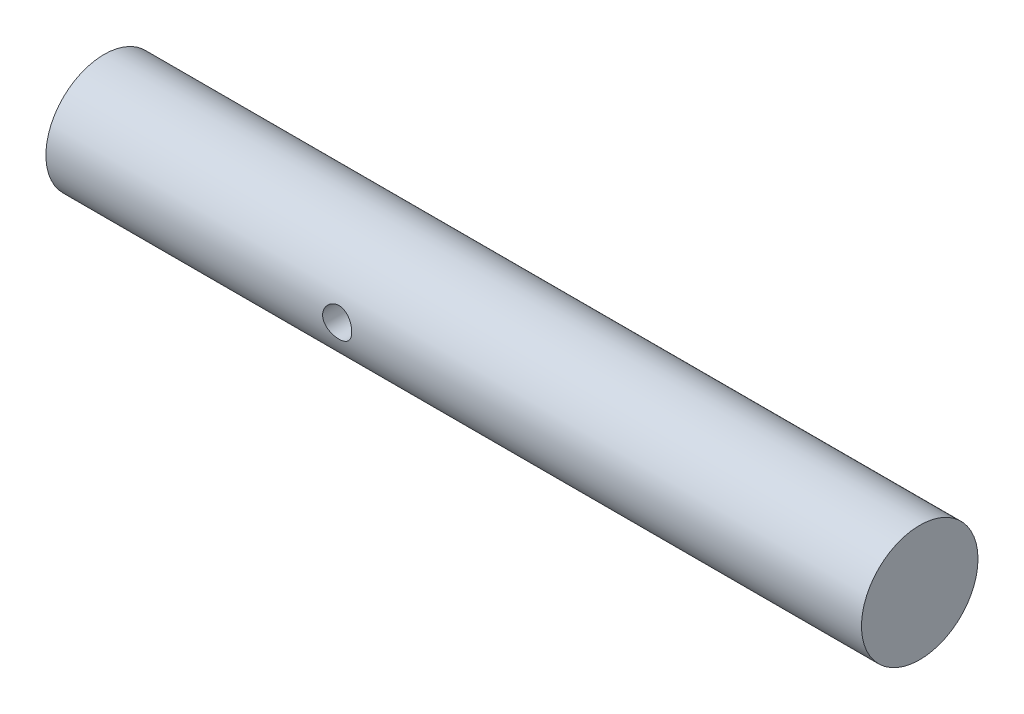
ISO-10303-21;
HEADER;
FILE_DESCRIPTION(('STEP AP214'),'2;1');
FILE_NAME('part.step','',(''),(''),'','','');
FILE_SCHEMA(('AUTOMOTIVE_DESIGN { 1 0 10303 214 1 1 1 1 }'));
ENDSEC;
DATA;
#1=APPLICATION_CONTEXT('core data for automotive mechanical design processes');
#2=APPLICATION_PROTOCOL_DEFINITION('international standard','automotive_design',2000,#1);
#3=PRODUCT_CONTEXT('',#1,'mechanical');
#4=PRODUCT('Part','Part','',(#3));
#5=PRODUCT_RELATED_PRODUCT_CATEGORY('part','',(#4));
#6=PRODUCT_DEFINITION_FORMATION('','',#4);
#7=PRODUCT_DEFINITION_CONTEXT('part definition',#1,'design');
#8=PRODUCT_DEFINITION('design','',#6,#7);
#9=PRODUCT_DEFINITION_SHAPE('','',#8);
#10=(LENGTH_UNIT() NAMED_UNIT(*) SI_UNIT(.MILLI.,.METRE.));
#11=(NAMED_UNIT(*) PLANE_ANGLE_UNIT() SI_UNIT($,.RADIAN.));
#12=(NAMED_UNIT(*) SI_UNIT($,.STERADIAN.) SOLID_ANGLE_UNIT());
#13=UNCERTAINTY_MEASURE_WITH_UNIT(LENGTH_MEASURE(1.E-05),#10,'distance_accuracy_value','');
#14=(GEOMETRIC_REPRESENTATION_CONTEXT(3) GLOBAL_UNCERTAINTY_ASSIGNED_CONTEXT((#13)) GLOBAL_UNIT_ASSIGNED_CONTEXT((#10,
#11,#12)) REPRESENTATION_CONTEXT('',''));
#15=CARTESIAN_POINT('',(0.,0.,0.));
#16=DIRECTION('',(0.,0.,1.));
#17=DIRECTION('',(1.,0.,0.));
#18=AXIS2_PLACEMENT_3D('',#15,#16,#17);
#19=CARTESIAN_POINT('',(0.,0.,0.));
#20=DIRECTION('',(1.,0.,0.));
#21=DIRECTION('',(0.,0.,-1.));
#22=AXIS2_PLACEMENT_3D('',#19,#20,#21);
#23=PLANE('',#22);
#24=CARTESIAN_POINT('',(0.,0.,0.));
#25=DIRECTION('',(1.,0.,0.));
#26=DIRECTION('',(0.,0.,-1.));
#27=AXIS2_PLACEMENT_3D('',#24,#25,#26);
#28=CIRCLE('',#27,12.7);
#29=CARTESIAN_POINT('',(0.,0.,-12.7));
#30=VERTEX_POINT('',#29);
#31=EDGE_CURVE('E56',#30,#30,#28,.T.);
#32=ORIENTED_EDGE('',*,*,#31,.F.);
#33=EDGE_LOOP('',(#32));
#34=FACE_BOUND('',#33,.T.);
#35=ADVANCED_FACE('F39',(#34),#23,.F.);
#36=CARTESIAN_POINT('',(177.8,0.,0.));
#37=DIRECTION('',(1.,0.,0.));
#38=DIRECTION('',(0.,0.,-1.));
#39=AXIS2_PLACEMENT_3D('',#36,#37,#38);
#40=PLANE('',#39);
#41=CARTESIAN_POINT('',(177.8,0.,0.));
#42=DIRECTION('',(1.,0.,0.));
#43=DIRECTION('',(0.,0.,-1.));
#44=AXIS2_PLACEMENT_3D('',#41,#42,#43);
#45=CIRCLE('',#44,12.7);
#46=CARTESIAN_POINT('',(177.8,0.,-12.7));
#47=VERTEX_POINT('',#46);
#48=EDGE_CURVE('E60',#47,#47,#45,.T.);
#49=ORIENTED_EDGE('',*,*,#48,.T.);
#50=EDGE_LOOP('',(#49));
#51=FACE_BOUND('',#50,.T.);
#52=ADVANCED_FACE('F61',(#51),#40,.T.);
#53=CARTESIAN_POINT('',(0.,0.,0.));
#54=DIRECTION('',(1.,0.,0.));
#55=DIRECTION('',(0.,0.,-1.));
#56=AXIS2_PLACEMENT_3D('',#53,#54,#55);
#57=CYLINDRICAL_SURFACE('',#56,12.7);
#58=CARTESIAN_POINT('',(60.325,0.,12.7));
#59=CARTESIAN_POINT('',(60.3250049228124,-0.175421054350931,12.6999970338729));
#60=CARTESIAN_POINT('',(60.3395871158045,-0.350897100741782,12.6963292371237));
#61=CARTESIAN_POINT('',(60.3974432369332,-0.69682005198096,12.6820530760661));
#62=CARTESIAN_POINT('',(60.4407334268551,-0.867264049209731,12.6714407780562));
#63=CARTESIAN_POINT('',(60.5545297531614,-1.19807751278645,12.6444507573613));
#64=CARTESIAN_POINT('',(60.6250032072807,-1.35845880926017,12.6280799601569));
#65=CARTESIAN_POINT('',(60.7910506089282,-1.6651226791977,12.591316443928));
#66=CARTESIAN_POINT('',(60.8866254031185,-1.81140477687155,12.5709235892463));
#67=CARTESIAN_POINT('',(61.1022416714347,-2.08873074612027,12.5278602543575));
#68=CARTESIAN_POINT('',(61.2227028336633,-2.2194428772959,12.5051546346353));
#69=CARTESIAN_POINT('',(61.4837738337241,-2.45903522924702,12.4602582924963));
#70=CARTESIAN_POINT('',(61.624385943571,-2.56791298487579,12.4380676284689));
#71=CARTESIAN_POINT('',(61.9243432299266,-2.76230618225783,12.3963594189446));
#72=CARTESIAN_POINT('',(62.0839356718785,-2.84745052370821,12.3768864828385));
#73=CARTESIAN_POINT('',(62.4157341380137,-2.9895734564324,12.343330973648));
#74=CARTESIAN_POINT('',(62.5879381405528,-3.04655655068163,12.3292475388652));
#75=CARTESIAN_POINT('',(62.9364237378602,-3.12960773790342,12.3084267567388));
#76=CARTESIAN_POINT('',(63.1125545299471,-3.15627230130284,12.3015478927701));
#77=CARTESIAN_POINT('',(63.4669134710486,-3.17978742389056,12.2954915053947));
#78=CARTESIAN_POINT('',(63.6451412741317,-3.176642833515,12.2963127290578));
#79=CARTESIAN_POINT('',(63.9940634597277,-3.14110481048737,12.3054365167726));
#80=CARTESIAN_POINT('',(64.1648357321016,-3.1094221534035,12.3135572669877));
#81=CARTESIAN_POINT('',(64.4985608910951,-3.01884119561133,12.3360753547043));
#82=CARTESIAN_POINT('',(64.6615132197445,-2.95994095604688,12.3504731393489));
#83=CARTESIAN_POINT('',(64.976878801067,-2.8159910616337,12.3840899110031));
#84=CARTESIAN_POINT('',(65.1291690636213,-2.73068344564301,12.4033560981111));
#85=CARTESIAN_POINT('',(65.4175279356519,-2.53652078423164,12.4445122129068));
#86=CARTESIAN_POINT('',(65.5535937000757,-2.42766161831204,12.4664025994163));
#87=CARTESIAN_POINT('',(65.8097143198865,-2.18580424890858,12.5111061380944));
#88=CARTESIAN_POINT('',(65.9292020039632,-2.05220624645107,12.533927803951));
#89=CARTESIAN_POINT('',(66.1441849632153,-1.76659522538282,12.5773596047503));
#90=CARTESIAN_POINT('',(66.2396795055245,-1.61458164448181,12.5979696721291));
#91=CARTESIAN_POINT('',(66.4041737408416,-1.29564529770894,12.6347586626604));
#92=CARTESIAN_POINT('',(66.4730813035385,-1.12867311562491,12.6509221227036));
#93=CARTESIAN_POINT('',(66.5816916304186,-0.785020883902428,12.676884242985));
#94=CARTESIAN_POINT('',(66.6213999810851,-0.608342698201855,12.6866841206814));
#95=CARTESIAN_POINT('',(66.6696185137662,-0.255142937325556,12.6986347345774));
#96=CARTESIAN_POINT('',(66.6789010718594,-0.0787330573083768,12.7009747992585));
#97=CARTESIAN_POINT('',(66.6681229456492,0.273119584996527,12.6982813685726));
#98=CARTESIAN_POINT('',(66.6480649027418,0.448562432914395,12.6932485369526));
#99=CARTESIAN_POINT('',(66.5798115772382,0.790816868910238,12.6764961338622));
#100=CARTESIAN_POINT('',(66.5320376589737,0.957717835150521,12.6648767569325));
#101=CARTESIAN_POINT('',(66.4101900054731,1.28112793569116,12.6362609570897));
#102=CARTESIAN_POINT('',(66.3361136142037,1.43763601861911,12.6192639911647));
#103=CARTESIAN_POINT('',(66.1622668605486,1.73889063454314,12.5813250177716));
#104=CARTESIAN_POINT('',(66.0620638954272,1.88337918521904,12.5603183592593));
#105=CARTESIAN_POINT('',(65.8393613597127,2.15376466554501,12.5167921111412));
#106=CARTESIAN_POINT('',(65.7168579411427,2.27965837982672,12.4942722608556));
#107=CARTESIAN_POINT('',(65.4494458495475,2.51246336908675,12.4495762556412));
#108=CARTESIAN_POINT('',(65.3040610286508,2.6188328531313,12.4274221051899));
#109=CARTESIAN_POINT('',(64.9970492570416,2.80566443991221,12.3865825924258));
#110=CARTESIAN_POINT('',(64.835423027713,2.88612769264177,12.3678970761538));
#111=CARTESIAN_POINT('',(64.501382887573,3.0182638402854,12.3363163381503));
#112=CARTESIAN_POINT('',(64.329039853404,3.07010730622843,12.3233869021911));
#113=CARTESIAN_POINT('',(63.9777112665412,3.14398164687971,12.3047494152553));
#114=CARTESIAN_POINT('',(63.7987271753439,3.16601904149253,12.299039785006));
#115=CARTESIAN_POINT('',(63.4447104994796,3.17931501621074,12.2956087422145));
#116=CARTESIAN_POINT('',(63.2697120956125,3.17143955029538,12.2976625750886));
#117=CARTESIAN_POINT('',(62.9236234356237,3.1271152390873,12.3090074061494));
#118=CARTESIAN_POINT('',(62.7525331010331,3.09066696801937,12.3182982588945));
#119=CARTESIAN_POINT('',(62.4200587616563,2.9907046261569,12.3429450180984));
#120=CARTESIAN_POINT('',(62.2586230372446,2.92735297324093,12.3582644892528));
#121=CARTESIAN_POINT('',(61.9485566065863,2.77551073379659,12.3932474960913));
#122=CARTESIAN_POINT('',(61.7999276800869,2.68701666057214,12.4129116342002));
#123=CARTESIAN_POINT('',(61.5155093686132,2.48468673461549,12.4550092586011));
#124=CARTESIAN_POINT('',(61.3801560612528,2.37025002816433,12.4775016056118));
#125=CARTESIAN_POINT('',(61.1302920885162,2.12045416901821,12.5223699100401));
#126=CARTESIAN_POINT('',(61.0157863795942,1.98509005500274,12.5447458385544));
#127=CARTESIAN_POINT('',(60.8088460635383,1.6943230585205,12.5873437112106));
#128=CARTESIAN_POINT('',(60.7168487343952,1.53860166056969,12.6075193062447));
#129=CARTESIAN_POINT('',(60.5604845367759,1.21341315929717,12.6429542453062));
#130=CARTESIAN_POINT('',(60.4960978699606,1.04395600927443,12.6582171100619));
#131=CARTESIAN_POINT('',(60.4063396258022,0.729001702698683,12.6798505941374));
#132=CARTESIAN_POINT('',(60.3759032022036,0.585004695088745,12.6873547169486));
#133=CARTESIAN_POINT('',(60.3352320860002,0.294017851418465,12.6974304774096));
#134=CARTESIAN_POINT('',(60.3249958739705,0.147028241296871,12.7000024860439));
#135=CARTESIAN_POINT('',(60.325,0.,12.7));
#136=B_SPLINE_CURVE_WITH_KNOTS('',3,(#58,#59,#60,#61,#62,#63,#64,#65,#66,#67,#68,#69,#70,#71,
#72,#73,#74,#75,#76,#77,#78,#79,#80,#81,#82,#83,#84,#85,#86,#87,#88,#89,#90,#91,#92,#93,#94,#95,
#96,#97,#98,#99,#100,#101,#102,#103,#104,#105,#106,#107,#108,#109,#110,#111,#112,#113,#114,#115,
#116,#117,#118,#119,#120,#121,#122,#123,#124,#125,#126,#127,#128,#129,#130,#131,#132,#133,#134,
#135),.UNSPECIFIED.,.T.,.F.,(4,2,2,2,2,2,2,2,2,2,2,2,2,2,2,2,2,2,2,2,2,2,2,2,2,2,2,2,2,2,2,2,2,
2,2,2,2,2,4),(0.,0.5257243580655,1.05174676993359,1.57713870983892,2.10254837335841,
2.63767221675277,3.17285644277797,3.71599137305291,4.25903942808496,4.79120824630598,
5.32329047345572,5.84247618671884,6.36169889010143,6.8861628400674,7.41071862276905,
7.9502317705812,8.48976139571986,9.0311441807632,9.57242335981322,10.09985087283,
10.6272309069567,11.1467958106174,11.6664131950588,12.1952509368702,12.7241800170733,
13.266092111565,13.8079801469349,14.34660272276,14.885107458967,15.4081433519175,
15.9311687337377,16.4510804786766,16.9710643590661,17.5046127008447,18.0382877269755,
18.5816279265762,19.1245778677202,19.5652441424438,20.005877269746),.UNSPECIFIED.);
#137=CARTESIAN_POINT('',(60.325,0.,12.7));
#138=VERTEX_POINT('',#137);
#139=EDGE_CURVE('E12',#138,#138,#136,.T.);
#140=ORIENTED_EDGE('',*,*,#139,.F.);
#141=EDGE_LOOP('',(#140));
#142=FACE_BOUND('',#141,.T.);
#143=CARTESIAN_POINT('',(117.475,0.,-12.7));
#144=CARTESIAN_POINT('',(117.474995077188,-0.175421054350931,-12.6999970338729));
#145=CARTESIAN_POINT('',(117.460412884195,-0.350897100741782,-12.6963292371237));
#146=CARTESIAN_POINT('',(117.402556763067,-0.696820051980961,-12.6820530760661));
#147=CARTESIAN_POINT('',(117.359266573145,-0.867264049209732,-12.6714407780562));
#148=CARTESIAN_POINT('',(117.245470246839,-1.19807751278645,-12.6444507573613));
#149=CARTESIAN_POINT('',(117.174996792719,-1.35845880926017,-12.6280799601569));
#150=CARTESIAN_POINT('',(117.008949391072,-1.6651226791977,-12.591316443928));
#151=CARTESIAN_POINT('',(116.913374596881,-1.81140477687155,-12.5709235892463));
#152=CARTESIAN_POINT('',(116.697758328565,-2.08873074612028,-12.5278602543575));
#153=CARTESIAN_POINT('',(116.577297166337,-2.21944287729591,-12.5051546346353));
#154=CARTESIAN_POINT('',(116.316226166276,-2.45903522924703,-12.4602582924963));
#155=CARTESIAN_POINT('',(116.175614056429,-2.56791298487579,-12.4380676284689));
#156=CARTESIAN_POINT('',(115.875656770073,-2.76230618225783,-12.3963594189446));
#157=CARTESIAN_POINT('',(115.716064328122,-2.84745052370821,-12.3768864828385));
#158=CARTESIAN_POINT('',(115.384265861986,-2.98957345643241,-12.343330973648));
#159=CARTESIAN_POINT('',(115.212061859447,-3.04655655068163,-12.3292475388652));
#160=CARTESIAN_POINT('',(114.86357626214,-3.12960773790342,-12.3084267567388));
#161=CARTESIAN_POINT('',(114.687445470053,-3.15627230130284,-12.3015478927701));
#162=CARTESIAN_POINT('',(114.333086528951,-3.17978742389056,-12.2954915053947));
#163=CARTESIAN_POINT('',(114.154858725868,-3.176642833515,-12.2963127290578));
#164=CARTESIAN_POINT('',(113.805936540272,-3.14110481048737,-12.3054365167726));
#165=CARTESIAN_POINT('',(113.635164267898,-3.1094221534035,-12.3135572669877));
#166=CARTESIAN_POINT('',(113.301439108905,-3.01884119561133,-12.3360753547043));
#167=CARTESIAN_POINT('',(113.138486780255,-2.95994095604688,-12.3504731393489));
#168=CARTESIAN_POINT('',(112.823121198933,-2.81599106163371,-12.3840899110031));
#169=CARTESIAN_POINT('',(112.670830936379,-2.73068344564301,-12.4033560981111));
#170=CARTESIAN_POINT('',(112.382472064348,-2.53652078423164,-12.4445122129068));
#171=CARTESIAN_POINT('',(112.246406299924,-2.42766161831205,-12.4664025994163));
#172=CARTESIAN_POINT('',(111.990285680114,-2.18580424890859,-12.5111061380944));
#173=CARTESIAN_POINT('',(111.870797996037,-2.05220624645107,-12.533927803951));
#174=CARTESIAN_POINT('',(111.655815036785,-1.76659522538282,-12.5773596047503));
#175=CARTESIAN_POINT('',(111.560320494475,-1.61458164448181,-12.5979696721291));
#176=CARTESIAN_POINT('',(111.395826259158,-1.29564529770894,-12.6347586626604));
#177=CARTESIAN_POINT('',(111.326918696461,-1.12867311562491,-12.6509221227036));
#178=CARTESIAN_POINT('',(111.218308369581,-0.78502088390243,-12.676884242985));
#179=CARTESIAN_POINT('',(111.178600018915,-0.608342698201857,-12.6866841206814));
#180=CARTESIAN_POINT('',(111.130381486234,-0.255142937325557,-12.6986347345774));
#181=CARTESIAN_POINT('',(111.121098928141,-0.0787330573083771,-12.7009747992585));
#182=CARTESIAN_POINT('',(111.131877054351,0.273119584996528,-12.6982813685726));
#183=CARTESIAN_POINT('',(111.151935097258,0.448562432914397,-12.6932485369526));
#184=CARTESIAN_POINT('',(111.220188422762,0.790816868910242,-12.6764961338622));
#185=CARTESIAN_POINT('',(111.267962341026,0.957717835150526,-12.6648767569325));
#186=CARTESIAN_POINT('',(111.389809994527,1.28112793569116,-12.6362609570897));
#187=CARTESIAN_POINT('',(111.463886385796,1.43763601861911,-12.6192639911647));
#188=CARTESIAN_POINT('',(111.637733139451,1.73889063454314,-12.5813250177716));
#189=CARTESIAN_POINT('',(111.737936104573,1.88337918521904,-12.5603183592593));
#190=CARTESIAN_POINT('',(111.960638640287,2.15376466554501,-12.5167921111412));
#191=CARTESIAN_POINT('',(112.083142058857,2.27965837982672,-12.4942722608556));
#192=CARTESIAN_POINT('',(112.350554150453,2.51246336908675,-12.4495762556412));
#193=CARTESIAN_POINT('',(112.495938971349,2.6188328531313,-12.4274221051899));
#194=CARTESIAN_POINT('',(112.802950742958,2.80566443991221,-12.3865825924258));
#195=CARTESIAN_POINT('',(112.964576972287,2.88612769264177,-12.3678970761538));
#196=CARTESIAN_POINT('',(113.298617112427,3.0182638402854,-12.3363163381503));
#197=CARTESIAN_POINT('',(113.470960146596,3.07010730622843,-12.3233869021911));
#198=CARTESIAN_POINT('',(113.822288733459,3.14398164687971,-12.3047494152553));
#199=CARTESIAN_POINT('',(114.001272824656,3.16601904149253,-12.299039785006));
#200=CARTESIAN_POINT('',(114.35528950052,3.17931501621074,-12.2956087422145));
#201=CARTESIAN_POINT('',(114.530287904387,3.17143955029538,-12.2976625750886));
#202=CARTESIAN_POINT('',(114.876376564376,3.1271152390873,-12.3090074061494));
#203=CARTESIAN_POINT('',(115.047466898967,3.09066696801937,-12.3182982588945));
#204=CARTESIAN_POINT('',(115.379941238344,2.9907046261569,-12.3429450180984));
#205=CARTESIAN_POINT('',(115.541376962755,2.92735297324093,-12.3582644892528));
#206=CARTESIAN_POINT('',(115.851443393414,2.77551073379659,-12.3932474960913));
#207=CARTESIAN_POINT('',(116.000072319913,2.68701666057214,-12.4129116342002));
#208=CARTESIAN_POINT('',(116.284490631387,2.48468673461549,-12.4550092586011));
#209=CARTESIAN_POINT('',(116.419843938747,2.37025002816433,-12.4775016056118));
#210=CARTESIAN_POINT('',(116.669707911484,2.12045416901821,-12.5223699100401));
#211=CARTESIAN_POINT('',(116.784213620406,1.98509005500273,-12.5447458385544));
#212=CARTESIAN_POINT('',(116.991153936462,1.69432305852049,-12.5873437112106));
#213=CARTESIAN_POINT('',(117.083151265605,1.53860166056969,-12.6075193062447));
#214=CARTESIAN_POINT('',(117.239515463224,1.21341315929717,-12.6429542453062));
#215=CARTESIAN_POINT('',(117.303902130039,1.04395600927443,-12.6582171100619));
#216=CARTESIAN_POINT('',(117.393660374198,0.729001702698679,-12.6798505941374));
#217=CARTESIAN_POINT('',(117.424096797796,0.585004695088744,-12.6873547169486));
#218=CARTESIAN_POINT('',(117.464767914,0.294017851418466,-12.6974304774096));
#219=CARTESIAN_POINT('',(117.47500412603,0.147028241296871,-12.7000024860439));
#220=CARTESIAN_POINT('',(117.475,0.,-12.7));
#221=B_SPLINE_CURVE_WITH_KNOTS('',3,(#143,#144,#145,#146,#147,#148,#149,#150,#151,#152,#153,
#154,#155,#156,#157,#158,#159,#160,#161,#162,#163,#164,#165,#166,#167,#168,#169,#170,#171,#172,
#173,#174,#175,#176,#177,#178,#179,#180,#181,#182,#183,#184,#185,#186,#187,#188,#189,#190,#191,
#192,#193,#194,#195,#196,#197,#198,#199,#200,#201,#202,#203,#204,#205,#206,#207,#208,#209,#210,
#211,#212,#213,#214,#215,#216,#217,#218,#219,#220),.UNSPECIFIED.,.T.,.F.,(4,2,2,2,2,2,2,2,2,2,2,
2,2,2,2,2,2,2,2,2,2,2,2,2,2,2,2,2,2,2,2,2,2,2,2,2,2,2,4),(0.,0.525724358065499,1.05174676993359,
1.57713870983892,2.10254837335841,2.63767221675278,3.17285644277798,3.7159913730529,
4.25903942808497,4.79120824630599,5.32329047345572,5.84247618671885,6.36169889010143,
6.88616284006739,7.41071862276905,7.9502317705812,8.48976139571986,9.0311441807632,
9.57242335981323,10.09985087283,10.6272309069567,11.1467958106174,11.6664131950588,
12.1952509368702,12.7241800170734,13.266092111565,13.8079801469349,14.34660272276,
14.8851074589671,15.4081433519175,15.9311687337377,16.4510804786766,16.9710643590661,
17.5046127008447,18.0382877269755,18.5816279265763,19.1245778677202,19.5652441424438,
20.005877269746),.UNSPECIFIED.);
#222=CARTESIAN_POINT('',(117.475,0.,-12.7));
#223=VERTEX_POINT('',#222);
#224=EDGE_CURVE('E51',#223,#223,#221,.T.);
#225=ORIENTED_EDGE('',*,*,#224,.F.);
#226=EDGE_LOOP('',(#225));
#227=FACE_BOUND('',#226,.T.);
#228=CARTESIAN_POINT('',(92.075,0.,-12.7));
#229=CARTESIAN_POINT('',(92.0749950771876,-0.175421054350932,-12.6999970338729));
#230=CARTESIAN_POINT('',(92.0604128841955,-0.350897100741784,-12.6963292371237));
#231=CARTESIAN_POINT('',(92.0025567630668,-0.696820051980962,-12.6820530760661));
#232=CARTESIAN_POINT('',(91.9592665731449,-0.867264049209733,-12.6714407780562));
#233=CARTESIAN_POINT('',(91.8454702468386,-1.19807751278645,-12.6444507573613));
#234=CARTESIAN_POINT('',(91.7749967927193,-1.35845880926017,-12.6280799601569));
#235=CARTESIAN_POINT('',(91.6089493910717,-1.66512267919771,-12.591316443928));
#236=CARTESIAN_POINT('',(91.5133745968815,-1.81140477687155,-12.5709235892463));
#237=CARTESIAN_POINT('',(91.2977583285653,-2.08873074612028,-12.5278602543575));
#238=CARTESIAN_POINT('',(91.1772971663366,-2.21944287729591,-12.5051546346353));
#239=CARTESIAN_POINT('',(90.9162261662759,-2.45903522924703,-12.4602582924963));
#240=CARTESIAN_POINT('',(90.775614056429,-2.56791298487579,-12.4380676284689));
#241=CARTESIAN_POINT('',(90.4756567700734,-2.76230618225783,-12.3963594189446));
#242=CARTESIAN_POINT('',(90.3160643281215,-2.84745052370822,-12.3768864828385));
#243=CARTESIAN_POINT('',(89.9842658619862,-2.98957345643241,-12.343330973648));
#244=CARTESIAN_POINT('',(89.8120618594472,-3.04655655068163,-12.3292475388652));
#245=CARTESIAN_POINT('',(89.4635762621398,-3.12960773790342,-12.3084267567388));
#246=CARTESIAN_POINT('',(89.2874454700529,-3.15627230130285,-12.3015478927701));
#247=CARTESIAN_POINT('',(88.9330865289514,-3.17978742389056,-12.2954915053947));
#248=CARTESIAN_POINT('',(88.7548587258683,-3.176642833515,-12.2963127290578));
#249=CARTESIAN_POINT('',(88.4059365402723,-3.14110481048737,-12.3054365167726));
#250=CARTESIAN_POINT('',(88.2351642678984,-3.1094221534035,-12.3135572669877));
#251=CARTESIAN_POINT('',(87.9014391089049,-3.01884119561133,-12.3360753547043));
#252=CARTESIAN_POINT('',(87.7384867802554,-2.95994095604688,-12.3504731393489));
#253=CARTESIAN_POINT('',(87.423121198933,-2.81599106163371,-12.3840899110031));
#254=CARTESIAN_POINT('',(87.2708309363787,-2.73068344564301,-12.4033560981111));
#255=CARTESIAN_POINT('',(86.9824720643481,-2.53652078423164,-12.4445122129068));
#256=CARTESIAN_POINT('',(86.8464062999243,-2.42766161831205,-12.4664025994163));
#257=CARTESIAN_POINT('',(86.5902856801135,-2.18580424890859,-12.5111061380944));
#258=CARTESIAN_POINT('',(86.4707979960368,-2.05220624645108,-12.533927803951));
#259=CARTESIAN_POINT('',(86.2558150367847,-1.76659522538283,-12.5773596047503));
#260=CARTESIAN_POINT('',(86.1603204944754,-1.61458164448181,-12.5979696721291));
#261=CARTESIAN_POINT('',(85.9958262591584,-1.29564529770894,-12.6347586626604));
#262=CARTESIAN_POINT('',(85.9269186964614,-1.12867311562491,-12.6509221227036));
#263=CARTESIAN_POINT('',(85.8183083695814,-0.78502088390243,-12.676884242985));
#264=CARTESIAN_POINT('',(85.7786000189149,-0.608342698201857,-12.6866841206814));
#265=CARTESIAN_POINT('',(85.7303814862338,-0.255142937325557,-12.6986347345774));
#266=CARTESIAN_POINT('',(85.7210989281406,-0.0787330573083773,-12.7009747992585));
#267=CARTESIAN_POINT('',(85.7318770543508,0.273119584996527,-12.6982813685726));
#268=CARTESIAN_POINT('',(85.7519350972582,0.448562432914397,-12.6932485369526));
#269=CARTESIAN_POINT('',(85.8201884227617,0.790816868910243,-12.6764961338622));
#270=CARTESIAN_POINT('',(85.8679623410263,0.957717835150529,-12.6648767569325));
#271=CARTESIAN_POINT('',(85.9898099945269,1.28112793569117,-12.6362609570897));
#272=CARTESIAN_POINT('',(86.0638863857963,1.43763601861912,-12.6192639911647));
#273=CARTESIAN_POINT('',(86.2377331394514,1.73889063454314,-12.5813250177716));
#274=CARTESIAN_POINT('',(86.3379361045727,1.88337918521905,-12.5603183592593));
#275=CARTESIAN_POINT('',(86.5606386402873,2.15376466554502,-12.5167921111412));
#276=CARTESIAN_POINT('',(86.6831420588573,2.27965837982672,-12.4942722608556));
#277=CARTESIAN_POINT('',(86.9505541504525,2.51246336908675,-12.4495762556412));
#278=CARTESIAN_POINT('',(87.0959389713492,2.6188328531313,-12.4274221051899));
#279=CARTESIAN_POINT('',(87.4029507429584,2.80566443991221,-12.3865825924258));
#280=CARTESIAN_POINT('',(87.564576972287,2.88612769264177,-12.3678970761538));
#281=CARTESIAN_POINT('',(87.898617112427,3.0182638402854,-12.3363163381503));
#282=CARTESIAN_POINT('',(88.070960146596,3.07010730622843,-12.3233869021911));
#283=CARTESIAN_POINT('',(88.4222887334588,3.14398164687971,-12.3047494152553));
#284=CARTESIAN_POINT('',(88.6012728246561,3.16601904149253,-12.299039785006));
#285=CARTESIAN_POINT('',(88.9552895005204,3.17931501621074,-12.2956087422145));
#286=CARTESIAN_POINT('',(89.1302879043875,3.17143955029538,-12.2976625750886));
#287=CARTESIAN_POINT('',(89.4763765643763,3.1271152390873,-12.3090074061494));
#288=CARTESIAN_POINT('',(89.6474668989669,3.09066696801937,-12.3182982588945));
#289=CARTESIAN_POINT('',(89.9799412383437,2.9907046261569,-12.3429450180984));
#290=CARTESIAN_POINT('',(90.1413769627554,2.92735297324093,-12.3582644892528));
#291=CARTESIAN_POINT('',(90.4514433934137,2.77551073379659,-12.3932474960913));
#292=CARTESIAN_POINT('',(90.6000723199131,2.68701666057214,-12.4129116342002));
#293=CARTESIAN_POINT('',(90.8844906313868,2.48468673461549,-12.4550092586011));
#294=CARTESIAN_POINT('',(91.0198439387472,2.37025002816433,-12.4775016056118));
#295=CARTESIAN_POINT('',(91.2697079114838,2.12045416901821,-12.5223699100401));
#296=CARTESIAN_POINT('',(91.3842136204058,1.98509005500273,-12.5447458385544));
#297=CARTESIAN_POINT('',(91.5911539364617,1.69432305852049,-12.5873437112106));
#298=CARTESIAN_POINT('',(91.6831512656048,1.53860166056968,-12.6075193062447));
#299=CARTESIAN_POINT('',(91.8395154632241,1.21341315929717,-12.6429542453062));
#300=CARTESIAN_POINT('',(91.9039021300394,1.04395600927443,-12.6582171100619));
#301=CARTESIAN_POINT('',(91.9936603741978,0.72900170269868,-12.6798505941374));
#302=CARTESIAN_POINT('',(92.0240967977964,0.585004695088745,-12.6873547169486));
#303=CARTESIAN_POINT('',(92.0647679139998,0.294017851418467,-12.6974304774096));
#304=CARTESIAN_POINT('',(92.0750041260296,0.147028241296872,-12.7000024860439));
#305=CARTESIAN_POINT('',(92.075,0.,-12.7));
#306=B_SPLINE_CURVE_WITH_KNOTS('',3,(#228,#229,#230,#231,#232,#233,#234,#235,#236,#237,#238,
#239,#240,#241,#242,#243,#244,#245,#246,#247,#248,#249,#250,#251,#252,#253,#254,#255,#256,#257,
#258,#259,#260,#261,#262,#263,#264,#265,#266,#267,#268,#269,#270,#271,#272,#273,#274,#275,#276,
#277,#278,#279,#280,#281,#282,#283,#284,#285,#286,#287,#288,#289,#290,#291,#292,#293,#294,#295,
#296,#297,#298,#299,#300,#301,#302,#303,#304,#305),.UNSPECIFIED.,.T.,.F.,(4,2,2,2,2,2,2,2,2,2,2,
2,2,2,2,2,2,2,2,2,2,2,2,2,2,2,2,2,2,2,2,2,2,2,2,2,2,2,4),(0.,0.525724358065501,1.05174676993359,
1.57713870983893,2.10254837335841,2.63767221675279,3.17285644277798,3.71599137305292,
4.25903942808497,4.791208246306,5.32329047345572,5.84247618671883,6.36169889010143,
6.88616284006739,7.41071862276906,7.95023177058119,8.48976139571986,9.0311441807632,
9.57242335981323,10.09985087283,10.6272309069567,11.1467958106174,11.6664131950588,
12.1952509368703,12.7241800170734,13.266092111565,13.8079801469349,14.34660272276,
14.8851074589671,15.4081433519176,15.9311687337377,16.4510804786766,16.9710643590661,
17.5046127008448,18.0382877269755,18.5816279265763,19.1245778677202,19.5652441424438,
20.005877269746),.UNSPECIFIED.);
#307=CARTESIAN_POINT('',(92.075,0.,-12.7));
#308=VERTEX_POINT('',#307);
#309=EDGE_CURVE('E103',#308,#308,#306,.T.);
#310=ORIENTED_EDGE('',*,*,#309,.F.);
#311=EDGE_LOOP('',(#310));
#312=FACE_BOUND('',#311,.T.);
#313=CARTESIAN_POINT('',(66.675,0.,-12.7));
#314=CARTESIAN_POINT('',(66.6749950771876,-0.175421054350931,-12.6999970338729));
#315=CARTESIAN_POINT('',(66.6604128841955,-0.350897100741782,-12.6963292371237));
#316=CARTESIAN_POINT('',(66.6025567630668,-0.696820051980961,-12.6820530760661));
#317=CARTESIAN_POINT('',(66.5592665731449,-0.867264049209732,-12.6714407780562));
#318=CARTESIAN_POINT('',(66.4454702468386,-1.19807751278646,-12.6444507573613));
#319=CARTESIAN_POINT('',(66.3749967927194,-1.35845880926017,-12.6280799601569));
#320=CARTESIAN_POINT('',(66.2089493910718,-1.66512267919771,-12.591316443928));
#321=CARTESIAN_POINT('',(66.1133745968815,-1.81140477687155,-12.5709235892463));
#322=CARTESIAN_POINT('',(65.8977583285653,-2.08873074612028,-12.5278602543575));
#323=CARTESIAN_POINT('',(65.7772971663367,-2.21944287729591,-12.5051546346353));
#324=CARTESIAN_POINT('',(65.5162261662759,-2.45903522924703,-12.4602582924963));
#325=CARTESIAN_POINT('',(65.375614056429,-2.56791298487579,-12.4380676284689));
#326=CARTESIAN_POINT('',(65.0756567700734,-2.76230618225783,-12.3963594189446));
#327=CARTESIAN_POINT('',(64.9160643281215,-2.84745052370821,-12.3768864828385));
#328=CARTESIAN_POINT('',(64.5842658619863,-2.98957345643241,-12.343330973648));
#329=CARTESIAN_POINT('',(64.4120618594472,-3.04655655068163,-12.3292475388652));
#330=CARTESIAN_POINT('',(64.0635762621398,-3.12960773790342,-12.3084267567388));
#331=CARTESIAN_POINT('',(63.8874454700529,-3.15627230130284,-12.3015478927701));
#332=CARTESIAN_POINT('',(63.5330865289514,-3.17978742389056,-12.2954915053947));
#333=CARTESIAN_POINT('',(63.3548587258683,-3.176642833515,-12.2963127290578));
#334=CARTESIAN_POINT('',(63.0059365402723,-3.14110481048737,-12.3054365167726));
#335=CARTESIAN_POINT('',(62.8351642678984,-3.1094221534035,-12.3135572669877));
#336=CARTESIAN_POINT('',(62.5014391089049,-3.01884119561133,-12.3360753547043));
#337=CARTESIAN_POINT('',(62.3384867802555,-2.95994095604688,-12.3504731393489));
#338=CARTESIAN_POINT('',(62.023121198933,-2.81599106163371,-12.3840899110031));
#339=CARTESIAN_POINT('',(61.8708309363787,-2.73068344564301,-12.4033560981111));
#340=CARTESIAN_POINT('',(61.5824720643481,-2.53652078423163,-12.4445122129068));
#341=CARTESIAN_POINT('',(61.4464062999243,-2.42766161831203,-12.4664025994163));
#342=CARTESIAN_POINT('',(61.1902856801135,-2.18580424890858,-12.5111061380944));
#343=CARTESIAN_POINT('',(61.0707979960368,-2.05220624645107,-12.533927803951));
#344=CARTESIAN_POINT('',(60.8558150367847,-1.76659522538283,-12.5773596047503));
#345=CARTESIAN_POINT('',(60.7603204944755,-1.61458164448181,-12.5979696721291));
#346=CARTESIAN_POINT('',(60.5958262591584,-1.29564529770895,-12.6347586626604));
#347=CARTESIAN_POINT('',(60.5269186964615,-1.12867311562492,-12.6509221227036));
#348=CARTESIAN_POINT('',(60.4183083695814,-0.785020883902431,-12.676884242985));
#349=CARTESIAN_POINT('',(60.3786000189149,-0.608342698201856,-12.6866841206814));
#350=CARTESIAN_POINT('',(60.3303814862338,-0.255142937325554,-12.6986347345774));
#351=CARTESIAN_POINT('',(60.3210989281406,-0.0787330573083749,-12.7009747992585));
#352=CARTESIAN_POINT('',(60.3318770543508,0.273119584996529,-12.6982813685726));
#353=CARTESIAN_POINT('',(60.3519350972582,0.448562432914399,-12.6932485369526));
#354=CARTESIAN_POINT('',(60.4201884227617,0.790816868910242,-12.6764961338622));
#355=CARTESIAN_POINT('',(60.4679623410263,0.957717835150525,-12.6648767569325));
#356=CARTESIAN_POINT('',(60.5898099945269,1.28112793569116,-12.6362609570897));
#357=CARTESIAN_POINT('',(60.6638863857963,1.43763601861912,-12.6192639911647));
#358=CARTESIAN_POINT('',(60.8377331394514,1.73889063454314,-12.5813250177716));
#359=CARTESIAN_POINT('',(60.9379361045727,1.88337918521904,-12.5603183592593));
#360=CARTESIAN_POINT('',(61.1606386402873,2.15376466554501,-12.5167921111412));
#361=CARTESIAN_POINT('',(61.2831420588573,2.27965837982672,-12.4942722608556));
#362=CARTESIAN_POINT('',(61.5505541504525,2.51246336908675,-12.4495762556412));
#363=CARTESIAN_POINT('',(61.6959389713492,2.6188328531313,-12.4274221051899));
#364=CARTESIAN_POINT('',(62.0029507429584,2.80566443991221,-12.3865825924258));
#365=CARTESIAN_POINT('',(62.164576972287,2.88612769264178,-12.3678970761538));
#366=CARTESIAN_POINT('',(62.498617112427,3.0182638402854,-12.3363163381503));
#367=CARTESIAN_POINT('',(62.670960146596,3.07010730622843,-12.3233869021911));
#368=CARTESIAN_POINT('',(63.0222887334588,3.14398164687971,-12.3047494152553));
#369=CARTESIAN_POINT('',(63.2012728246561,3.16601904149253,-12.299039785006));
#370=CARTESIAN_POINT('',(63.5552895005204,3.17931501621074,-12.2956087422145));
#371=CARTESIAN_POINT('',(63.7302879043875,3.17143955029538,-12.2976625750886));
#372=CARTESIAN_POINT('',(64.0763765643763,3.1271152390873,-12.3090074061494));
#373=CARTESIAN_POINT('',(64.2474668989669,3.09066696801937,-12.3182982588945));
#374=CARTESIAN_POINT('',(64.5799412383437,2.9907046261569,-12.3429450180984));
#375=CARTESIAN_POINT('',(64.7413769627554,2.92735297324093,-12.3582644892528));
#376=CARTESIAN_POINT('',(65.0514433934137,2.77551073379659,-12.3932474960913));
#377=CARTESIAN_POINT('',(65.2000723199131,2.68701666057214,-12.4129116342002));
#378=CARTESIAN_POINT('',(65.4844906313868,2.48468673461549,-12.4550092586011));
#379=CARTESIAN_POINT('',(65.6198439387472,2.37025002816432,-12.4775016056118));
#380=CARTESIAN_POINT('',(65.8697079114838,2.1204541690182,-12.5223699100401));
#381=CARTESIAN_POINT('',(65.9842136204059,1.98509005500273,-12.5447458385544));
#382=CARTESIAN_POINT('',(66.1911539364617,1.69432305852049,-12.5873437112106));
#383=CARTESIAN_POINT('',(66.2831512656048,1.53860166056968,-12.6075193062447));
#384=CARTESIAN_POINT('',(66.4395154632241,1.21341315929717,-12.6429542453062));
#385=CARTESIAN_POINT('',(66.5039021300394,1.04395600927443,-12.6582171100619));
#386=CARTESIAN_POINT('',(66.5936603741978,0.72900170269868,-12.6798505941374));
#387=CARTESIAN_POINT('',(66.6240967977964,0.585004695088744,-12.6873547169486));
#388=CARTESIAN_POINT('',(66.6647679139998,0.294017851418466,-12.6974304774096));
#389=CARTESIAN_POINT('',(66.6750041260296,0.147028241296871,-12.7000024860439));
#390=CARTESIAN_POINT('',(66.675,0.,-12.7));
#391=B_SPLINE_CURVE_WITH_KNOTS('',3,(#313,#314,#315,#316,#317,#318,#319,#320,#321,#322,#323,
#324,#325,#326,#327,#328,#329,#330,#331,#332,#333,#334,#335,#336,#337,#338,#339,#340,#341,#342,
#343,#344,#345,#346,#347,#348,#349,#350,#351,#352,#353,#354,#355,#356,#357,#358,#359,#360,#361,
#362,#363,#364,#365,#366,#367,#368,#369,#370,#371,#372,#373,#374,#375,#376,#377,#378,#379,#380,
#381,#382,#383,#384,#385,#386,#387,#388,#389,#390),.UNSPECIFIED.,.T.,.F.,(4,2,2,2,2,2,2,2,2,2,2,
2,2,2,2,2,2,2,2,2,2,2,2,2,2,2,2,2,2,2,2,2,2,2,2,2,2,2,4),(0.,0.525724358065499,1.05174676993359,
1.57713870983893,2.10254837335841,2.63767221675279,3.17285644277798,3.7159913730529,
4.25903942808497,4.79120824630599,5.32329047345572,5.84247618671883,6.36169889010144,
6.8861628400674,7.41071862276907,7.9502317705812,8.48976139571985,9.0311441807632,
9.57242335981323,10.09985087283,10.6272309069567,11.1467958106174,11.6664131950588,
12.1952509368702,12.7241800170734,13.266092111565,13.8079801469349,14.34660272276,
14.8851074589671,15.4081433519175,15.9311687337377,16.4510804786766,16.9710643590661,
17.5046127008448,18.0382877269755,18.5816279265763,19.1245778677202,19.5652441424438,
20.005877269746),.UNSPECIFIED.);
#392=CARTESIAN_POINT('',(66.675,0.,-12.7));
#393=VERTEX_POINT('',#392);
#394=EDGE_CURVE('E66',#393,#393,#391,.T.);
#395=ORIENTED_EDGE('',*,*,#394,.F.);
#396=EDGE_LOOP('',(#395));
#397=FACE_BOUND('',#396,.T.);
#398=CARTESIAN_POINT('',(142.875,0.,-12.7));
#399=CARTESIAN_POINT('',(142.874995077188,-0.175421054350929,-12.6999970338729));
#400=CARTESIAN_POINT('',(142.860412884195,-0.350897100741779,-12.6963292371237));
#401=CARTESIAN_POINT('',(142.802556763067,-0.696820051980959,-12.6820530760661));
#402=CARTESIAN_POINT('',(142.759266573145,-0.867264049209733,-12.6714407780562));
#403=CARTESIAN_POINT('',(142.645470246839,-1.19807751278645,-12.6444507573613));
#404=CARTESIAN_POINT('',(142.574996792719,-1.35845880926017,-12.6280799601569));
#405=CARTESIAN_POINT('',(142.408949391072,-1.6651226791977,-12.591316443928));
#406=CARTESIAN_POINT('',(142.313374596882,-1.81140477687155,-12.5709235892463));
#407=CARTESIAN_POINT('',(142.097758328565,-2.08873074612027,-12.5278602543575));
#408=CARTESIAN_POINT('',(141.977297166337,-2.2194428772959,-12.5051546346353));
#409=CARTESIAN_POINT('',(141.716226166276,-2.45903522924702,-12.4602582924963));
#410=CARTESIAN_POINT('',(141.575614056429,-2.56791298487578,-12.4380676284689));
#411=CARTESIAN_POINT('',(141.275656770073,-2.76230618225783,-12.3963594189446));
#412=CARTESIAN_POINT('',(141.116064328122,-2.84745052370821,-12.3768864828385));
#413=CARTESIAN_POINT('',(140.784265861986,-2.98957345643241,-12.343330973648));
#414=CARTESIAN_POINT('',(140.612061859447,-3.04655655068163,-12.3292475388652));
#415=CARTESIAN_POINT('',(140.26357626214,-3.12960773790342,-12.3084267567388));
#416=CARTESIAN_POINT('',(140.087445470053,-3.15627230130285,-12.3015478927701));
#417=CARTESIAN_POINT('',(139.733086528951,-3.17978742389056,-12.2954915053947));
#418=CARTESIAN_POINT('',(139.554858725868,-3.176642833515,-12.2963127290578));
#419=CARTESIAN_POINT('',(139.205936540272,-3.14110481048737,-12.3054365167726));
#420=CARTESIAN_POINT('',(139.035164267898,-3.10942215340351,-12.3135572669877));
#421=CARTESIAN_POINT('',(138.701439108905,-3.01884119561134,-12.3360753547043));
#422=CARTESIAN_POINT('',(138.538486780255,-2.95994095604688,-12.3504731393489));
#423=CARTESIAN_POINT('',(138.223121198933,-2.8159910616337,-12.3840899110031));
#424=CARTESIAN_POINT('',(138.070830936379,-2.730683445643,-12.4033560981111));
#425=CARTESIAN_POINT('',(137.782472064348,-2.53652078423162,-12.4445122129068));
#426=CARTESIAN_POINT('',(137.646406299924,-2.42766161831203,-12.4664025994163));
#427=CARTESIAN_POINT('',(137.390285680113,-2.18580424890858,-12.5111061380944));
#428=CARTESIAN_POINT('',(137.270797996037,-2.05220624645106,-12.533927803951));
#429=CARTESIAN_POINT('',(137.055815036785,-1.76659522538282,-12.5773596047503));
#430=CARTESIAN_POINT('',(136.960320494475,-1.61458164448181,-12.5979696721291));
#431=CARTESIAN_POINT('',(136.795826259158,-1.29564529770894,-12.6347586626604));
#432=CARTESIAN_POINT('',(136.726918696461,-1.12867311562491,-12.6509221227036));
#433=CARTESIAN_POINT('',(136.618308369581,-0.785020883902428,-12.676884242985));
#434=CARTESIAN_POINT('',(136.578600018915,-0.608342698201852,-12.6866841206814));
#435=CARTESIAN_POINT('',(136.530381486234,-0.25514293732555,-12.6986347345774));
#436=CARTESIAN_POINT('',(136.521098928141,-0.0787330573083723,-12.7009747992585));
#437=CARTESIAN_POINT('',(136.531877054351,0.27311958499653,-12.6982813685726));
#438=CARTESIAN_POINT('',(136.551935097258,0.448562432914399,-12.6932485369526));
#439=CARTESIAN_POINT('',(136.620188422762,0.79081686891024,-12.6764961338622));
#440=CARTESIAN_POINT('',(136.667962341026,0.957717835150522,-12.6648767569325));
#441=CARTESIAN_POINT('',(136.789809994527,1.28112793569116,-12.6362609570897));
#442=CARTESIAN_POINT('',(136.863886385796,1.43763601861912,-12.6192639911647));
#443=CARTESIAN_POINT('',(137.037733139451,1.73889063454314,-12.5813250177716));
#444=CARTESIAN_POINT('',(137.137936104573,1.88337918521903,-12.5603183592593));
#445=CARTESIAN_POINT('',(137.360638640287,2.15376466554501,-12.5167921111412));
#446=CARTESIAN_POINT('',(137.483142058857,2.27965837982672,-12.4942722608556));
#447=CARTESIAN_POINT('',(137.750554150453,2.51246336908675,-12.4495762556412));
#448=CARTESIAN_POINT('',(137.895938971349,2.6188328531313,-12.4274221051899));
#449=CARTESIAN_POINT('',(138.202950742958,2.80566443991221,-12.3865825924258));
#450=CARTESIAN_POINT('',(138.364576972287,2.88612769264178,-12.3678970761538));
#451=CARTESIAN_POINT('',(138.698617112427,3.0182638402854,-12.3363163381503));
#452=CARTESIAN_POINT('',(138.870960146596,3.07010730622843,-12.3233869021911));
#453=CARTESIAN_POINT('',(139.222288733459,3.14398164687971,-12.3047494152553));
#454=CARTESIAN_POINT('',(139.401272824656,3.16601904149253,-12.299039785006));
#455=CARTESIAN_POINT('',(139.75528950052,3.17931501621074,-12.2956087422145));
#456=CARTESIAN_POINT('',(139.930287904387,3.17143955029538,-12.2976625750886));
#457=CARTESIAN_POINT('',(140.276376564376,3.1271152390873,-12.3090074061494));
#458=CARTESIAN_POINT('',(140.447466898967,3.09066696801937,-12.3182982588945));
#459=CARTESIAN_POINT('',(140.779941238344,2.99070462615689,-12.3429450180984));
#460=CARTESIAN_POINT('',(140.941376962755,2.92735297324092,-12.3582644892528));
#461=CARTESIAN_POINT('',(141.251443393414,2.77551073379659,-12.3932474960913));
#462=CARTESIAN_POINT('',(141.400072319913,2.68701666057215,-12.4129116342002));
#463=CARTESIAN_POINT('',(141.684490631387,2.4846867346155,-12.4550092586011));
#464=CARTESIAN_POINT('',(141.819843938747,2.37025002816434,-12.4775016056118));
#465=CARTESIAN_POINT('',(142.069707911484,2.12045416901821,-12.5223699100401));
#466=CARTESIAN_POINT('',(142.184213620406,1.98509005500273,-12.5447458385544));
#467=CARTESIAN_POINT('',(142.391153936462,1.69432305852048,-12.5873437112106));
#468=CARTESIAN_POINT('',(142.483151265605,1.53860166056967,-12.6075193062447));
#469=CARTESIAN_POINT('',(142.639515463224,1.21341315929716,-12.6429542453062));
#470=CARTESIAN_POINT('',(142.703902130039,1.04395600927442,-12.6582171100619));
#471=CARTESIAN_POINT('',(142.793660374198,0.729001702698675,-12.6798505941374));
#472=CARTESIAN_POINT('',(142.824096797796,0.585004695088738,-12.6873547169486));
#473=CARTESIAN_POINT('',(142.864767914,0.294017851418461,-12.6974304774096));
#474=CARTESIAN_POINT('',(142.87500412603,0.147028241296869,-12.7000024860439));
#475=CARTESIAN_POINT('',(142.875,0.,-12.7));
#476=B_SPLINE_CURVE_WITH_KNOTS('',3,(#398,#399,#400,#401,#402,#403,#404,#405,#406,#407,#408,
#409,#410,#411,#412,#413,#414,#415,#416,#417,#418,#419,#420,#421,#422,#423,#424,#425,#426,#427,
#428,#429,#430,#431,#432,#433,#434,#435,#436,#437,#438,#439,#440,#441,#442,#443,#444,#445,#446,
#447,#448,#449,#450,#451,#452,#453,#454,#455,#456,#457,#458,#459,#460,#461,#462,#463,#464,#465,
#466,#467,#468,#469,#470,#471,#472,#473,#474,#475),.UNSPECIFIED.,.T.,.F.,(4,2,2,2,2,2,2,2,2,2,2,
2,2,2,2,2,2,2,2,2,2,2,2,2,2,2,2,2,2,2,2,2,2,2,2,2,2,2,4),(0.,0.525724358065496,1.05174676993359,
1.57713870983893,2.10254837335841,2.63767221675275,3.17285644277797,3.71599137305291,
4.25903942808498,4.79120824630599,5.32329047345571,5.84247618671883,6.36169889010145,
6.88616284006741,7.41071862276907,7.9502317705812,8.48976139571986,9.03114418076322,
9.57242335981323,10.09985087283,10.6272309069567,11.1467958106174,11.6664131950588,
12.1952509368702,12.7241800170734,13.266092111565,13.8079801469349,14.34660272276,
14.885107458967,15.4081433519175,15.9311687337377,16.4510804786766,16.971064359066,
17.5046127008447,18.0382877269755,18.5816279265763,19.1245778677202,19.5652441424438,
20.005877269746),.UNSPECIFIED.);
#477=CARTESIAN_POINT('',(142.875,0.,-12.7));
#478=VERTEX_POINT('',#477);
#479=EDGE_CURVE('E63',#478,#478,#476,.T.);
#480=ORIENTED_EDGE('',*,*,#479,.F.);
#481=EDGE_LOOP('',(#480));
#482=FACE_BOUND('',#481,.T.);
#483=ORIENTED_EDGE('',*,*,#48,.F.);
#484=EDGE_LOOP('',(#483));
#485=FACE_BOUND('',#484,.T.);
#486=ORIENTED_EDGE('',*,*,#31,.T.);
#487=EDGE_LOOP('',(#486));
#488=FACE_BOUND('',#487,.T.);
#489=ADVANCED_FACE('F81',(#142,#227,#312,#397,#482,#485,#488),#57,.T.);
#490=CARTESIAN_POINT('',(139.7,0.,-12.7));
#491=DIRECTION('',(0.,0.,1.));
#492=DIRECTION('',(1.,0.,0.));
#493=AXIS2_PLACEMENT_3D('',#490,#491,#492);
#494=CYLINDRICAL_SURFACE('',#493,3.175);
#495=ORIENTED_EDGE('',*,*,#479,.T.);
#496=EDGE_LOOP('',(#495));
#497=FACE_BOUND('',#496,.T.);
#498=CARTESIAN_POINT('',(139.7,0.,0.));
#499=DIRECTION('',(0.,0.,1.));
#500=DIRECTION('',(1.,0.,0.));
#501=AXIS2_PLACEMENT_3D('',#498,#499,#500);
#502=CIRCLE('',#501,3.175);
#503=CARTESIAN_POINT('',(142.875,0.,0.));
#504=VERTEX_POINT('',#503);
#505=EDGE_CURVE('E68',#504,#504,#502,.T.);
#506=ORIENTED_EDGE('',*,*,#505,.T.);
#507=EDGE_LOOP('',(#506));
#508=FACE_BOUND('',#507,.T.);
#509=ADVANCED_FACE('F83',(#497,#508),#494,.F.);
#510=CARTESIAN_POINT('',(139.7,0.,0.));
#511=DIRECTION('',(0.,0.,1.));
#512=DIRECTION('',(1.,0.,0.));
#513=AXIS2_PLACEMENT_3D('',#510,#511,#512);
#514=PLANE('',#513);
#515=ORIENTED_EDGE('',*,*,#505,.F.);
#516=EDGE_LOOP('',(#515));
#517=FACE_BOUND('',#516,.T.);
#518=ADVANCED_FACE('F87',(#517),#514,.F.);
#519=CARTESIAN_POINT('',(63.5,0.,-12.7));
#520=DIRECTION('',(0.,0.,1.));
#521=DIRECTION('',(1.,0.,0.));
#522=AXIS2_PLACEMENT_3D('',#519,#520,#521);
#523=CYLINDRICAL_SURFACE('',#522,3.175);
#524=ORIENTED_EDGE('',*,*,#394,.T.);
#525=EDGE_LOOP('',(#524));
#526=FACE_BOUND('',#525,.T.);
#527=ORIENTED_EDGE('',*,*,#139,.T.);
#528=EDGE_LOOP('',(#527));
#529=FACE_BOUND('',#528,.T.);
#530=ADVANCED_FACE('F90',(#526,#529),#523,.F.);
#531=CARTESIAN_POINT('',(88.9,0.,-12.7));
#532=DIRECTION('',(0.,0.,1.));
#533=DIRECTION('',(1.,0.,0.));
#534=AXIS2_PLACEMENT_3D('',#531,#532,#533);
#535=CYLINDRICAL_SURFACE('',#534,3.175);
#536=ORIENTED_EDGE('',*,*,#309,.T.);
#537=EDGE_LOOP('',(#536));
#538=FACE_BOUND('',#537,.T.);
#539=CARTESIAN_POINT('',(88.9,0.,0.));
#540=DIRECTION('',(0.,0.,1.));
#541=DIRECTION('',(1.,0.,0.));
#542=AXIS2_PLACEMENT_3D('',#539,#540,#541);
#543=CIRCLE('',#542,3.175);
#544=CARTESIAN_POINT('',(92.075,0.,0.));
#545=VERTEX_POINT('',#544);
#546=EDGE_CURVE('E145',#545,#545,#543,.T.);
#547=ORIENTED_EDGE('',*,*,#546,.T.);
#548=EDGE_LOOP('',(#547));
#549=FACE_BOUND('',#548,.T.);
#550=ADVANCED_FACE('F95',(#538,#549),#535,.F.);
#551=CARTESIAN_POINT('',(88.9,0.,0.));
#552=DIRECTION('',(0.,0.,1.));
#553=DIRECTION('',(1.,0.,0.));
#554=AXIS2_PLACEMENT_3D('',#551,#552,#553);
#555=PLANE('',#554);
#556=ORIENTED_EDGE('',*,*,#546,.F.);
#557=EDGE_LOOP('',(#556));
#558=FACE_BOUND('',#557,.T.);
#559=ADVANCED_FACE('F100',(#558),#555,.F.);
#560=CARTESIAN_POINT('',(114.3,0.,-12.7));
#561=DIRECTION('',(0.,0.,1.));
#562=DIRECTION('',(1.,0.,0.));
#563=AXIS2_PLACEMENT_3D('',#560,#561,#562);
#564=CYLINDRICAL_SURFACE('',#563,3.175);
#565=ORIENTED_EDGE('',*,*,#224,.T.);
#566=EDGE_LOOP('',(#565));
#567=FACE_BOUND('',#566,.T.);
#568=CARTESIAN_POINT('',(114.3,0.,0.));
#569=DIRECTION('',(0.,0.,1.));
#570=DIRECTION('',(1.,0.,0.));
#571=AXIS2_PLACEMENT_3D('',#568,#569,#570);
#572=CIRCLE('',#571,3.175);
#573=CARTESIAN_POINT('',(117.475,0.,0.));
#574=VERTEX_POINT('',#573);
#575=EDGE_CURVE('E143',#574,#574,#572,.T.);
#576=ORIENTED_EDGE('',*,*,#575,.T.);
#577=EDGE_LOOP('',(#576));
#578=FACE_BOUND('',#577,.T.);
#579=ADVANCED_FACE('F112',(#567,#578),#564,.F.);
#580=CARTESIAN_POINT('',(114.3,0.,0.));
#581=DIRECTION('',(0.,0.,1.));
#582=DIRECTION('',(1.,0.,0.));
#583=AXIS2_PLACEMENT_3D('',#580,#581,#582);
#584=PLANE('',#583);
#585=ORIENTED_EDGE('',*,*,#575,.F.);
#586=EDGE_LOOP('',(#585));
#587=FACE_BOUND('',#586,.T.);
#588=ADVANCED_FACE('F116',(#587),#584,.F.);
#589=CLOSED_SHELL('',(#35,#52,#489,#509,#518,#530,#550,#559,#579,#588));
#590=MANIFOLD_SOLID_BREP('B2',#589);
#591=ADVANCED_BREP_SHAPE_REPRESENTATION('',(#18,#590),#14);
#592=SHAPE_DEFINITION_REPRESENTATION(#9,#591);
ENDSEC;
END-ISO-10303-21;
